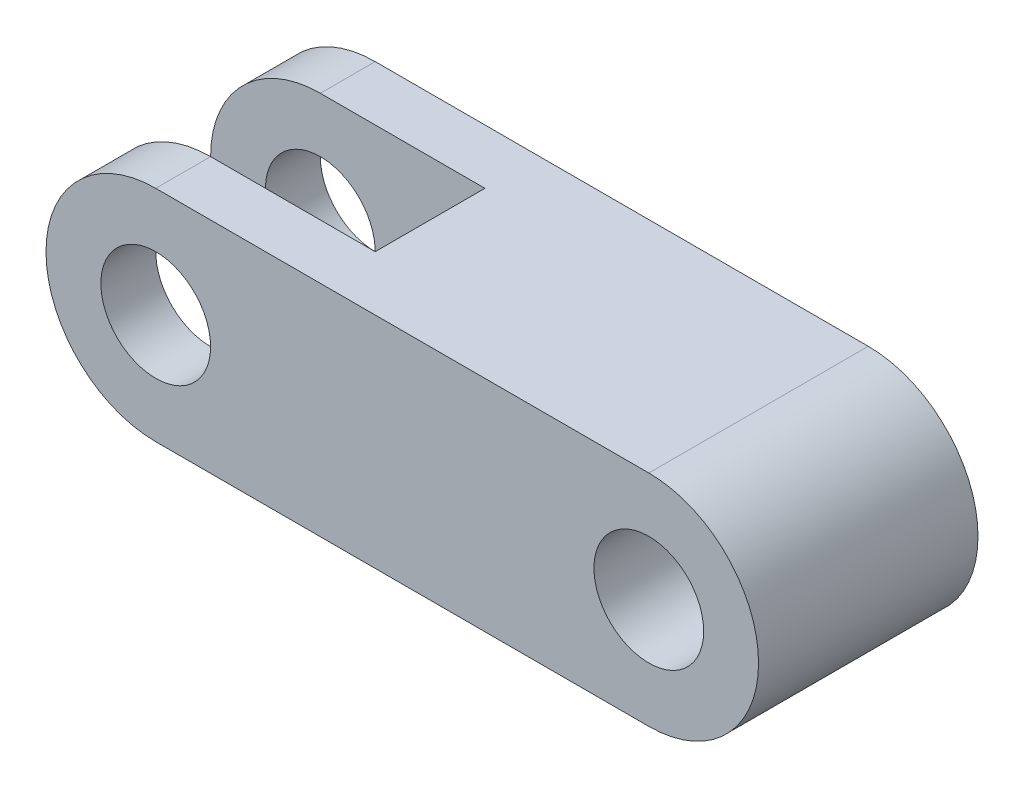
ISO-10303-21;
HEADER;
FILE_DESCRIPTION(('STEP AP214'),'2;1');
FILE_NAME('part.step','',(''),(''),'','','');
FILE_SCHEMA(('AUTOMOTIVE_DESIGN { 1 0 10303 214 1 1 1 1 }'));
ENDSEC;
DATA;
#1=APPLICATION_CONTEXT('core data for automotive mechanical design processes');
#2=APPLICATION_PROTOCOL_DEFINITION('international standard','automotive_design',2000,#1);
#3=PRODUCT_CONTEXT('',#1,'mechanical');
#4=PRODUCT('Part','Part','',(#3));
#5=PRODUCT_RELATED_PRODUCT_CATEGORY('part','',(#4));
#6=PRODUCT_DEFINITION_FORMATION('','',#4);
#7=PRODUCT_DEFINITION_CONTEXT('part definition',#1,'design');
#8=PRODUCT_DEFINITION('design','',#6,#7);
#9=PRODUCT_DEFINITION_SHAPE('','',#8);
#10=(LENGTH_UNIT() NAMED_UNIT(*) SI_UNIT(.MILLI.,.METRE.));
#11=(NAMED_UNIT(*) PLANE_ANGLE_UNIT() SI_UNIT($,.RADIAN.));
#12=(NAMED_UNIT(*) SI_UNIT($,.STERADIAN.) SOLID_ANGLE_UNIT());
#13=UNCERTAINTY_MEASURE_WITH_UNIT(LENGTH_MEASURE(1.E-05),#10,'distance_accuracy_value','');
#14=(GEOMETRIC_REPRESENTATION_CONTEXT(3) GLOBAL_UNCERTAINTY_ASSIGNED_CONTEXT((#13)) GLOBAL_UNIT_ASSIGNED_CONTEXT((#10,
#11,#12)) REPRESENTATION_CONTEXT('',''));
#15=CARTESIAN_POINT('',(0.,0.,0.));
#16=DIRECTION('',(0.,0.,1.));
#17=DIRECTION('',(1.,0.,0.));
#18=AXIS2_PLACEMENT_3D('',#15,#16,#17);
#19=CARTESIAN_POINT('',(0.,0.,20.));
#20=DIRECTION('',(0.,0.,-1.));
#21=DIRECTION('',(-1.,0.,0.));
#22=AXIS2_PLACEMENT_3D('',#19,#20,#21);
#23=CYLINDRICAL_SURFACE('',#22,10.);
#24=DIRECTION('',(0.,0.,-1.));
#25=VECTOR('',#24,1.);
#26=CARTESIAN_POINT('',(0.,10.,20.));
#27=LINE('',#26,#25);
#28=CARTESIAN_POINT('',(0.,10.,20.));
#29=VERTEX_POINT('',#28);
#30=CARTESIAN_POINT('',(0.,10.,15.));
#31=VERTEX_POINT('',#30);
#32=EDGE_CURVE('E167',#29,#31,#27,.T.);
#33=ORIENTED_EDGE('',*,*,#32,.T.);
#34=CARTESIAN_POINT('',(0.,0.,15.));
#35=DIRECTION('',(0.,0.,1.));
#36=DIRECTION('',(1.,0.,0.));
#37=AXIS2_PLACEMENT_3D('',#34,#35,#36);
#38=CIRCLE('',#37,10.);
#39=CARTESIAN_POINT('',(0.,-10.,15.));
#40=VERTEX_POINT('',#39);
#41=EDGE_CURVE('E139',#31,#40,#38,.T.);
#42=ORIENTED_EDGE('',*,*,#41,.T.);
#43=DIRECTION('',(0.,0.,-1.));
#44=VECTOR('',#43,1.);
#45=CARTESIAN_POINT('',(0.,-10.,20.));
#46=LINE('',#45,#44);
#47=CARTESIAN_POINT('',(0.,-10.,20.));
#48=VERTEX_POINT('',#47);
#49=EDGE_CURVE('E11',#48,#40,#46,.T.);
#50=ORIENTED_EDGE('',*,*,#49,.F.);
#51=CARTESIAN_POINT('',(0.,0.,20.));
#52=DIRECTION('',(0.,0.,1.));
#53=DIRECTION('',(1.,0.,0.));
#54=AXIS2_PLACEMENT_3D('',#51,#52,#53);
#55=CIRCLE('',#54,10.);
#56=EDGE_CURVE('E154',#29,#48,#55,.T.);
#57=ORIENTED_EDGE('',*,*,#56,.F.);
#58=EDGE_LOOP('',(#33,#42,#50,#57));
#59=FACE_BOUND('',#58,.T.);
#60=ADVANCED_FACE('F33',(#59),#23,.T.);
#61=CARTESIAN_POINT('',(0.,0.,20.));
#62=DIRECTION('',(0.,0.,-1.));
#63=DIRECTION('',(-1.,0.,0.));
#64=AXIS2_PLACEMENT_3D('',#61,#62,#63);
#65=CYLINDRICAL_SURFACE('',#64,5.);
#66=CARTESIAN_POINT('',(0.,0.,15.));
#67=DIRECTION('',(0.,0.,1.));
#68=DIRECTION('',(1.,0.,0.));
#69=AXIS2_PLACEMENT_3D('',#66,#67,#68);
#70=CIRCLE('',#69,5.);
#71=CARTESIAN_POINT('',(5.,0.,15.));
#72=VERTEX_POINT('',#71);
#73=EDGE_CURVE('E37',#72,#72,#70,.T.);
#74=ORIENTED_EDGE('',*,*,#73,.F.);
#75=EDGE_LOOP('',(#74));
#76=FACE_BOUND('',#75,.T.);
#77=CARTESIAN_POINT('',(0.,0.,20.));
#78=DIRECTION('',(0.,0.,1.));
#79=DIRECTION('',(1.,0.,0.));
#80=AXIS2_PLACEMENT_3D('',#77,#78,#79);
#81=CIRCLE('',#80,5.);
#82=CARTESIAN_POINT('',(5.,0.,20.));
#83=VERTEX_POINT('',#82);
#84=EDGE_CURVE('E148',#83,#83,#81,.T.);
#85=ORIENTED_EDGE('',*,*,#84,.T.);
#86=EDGE_LOOP('',(#85));
#87=FACE_BOUND('',#86,.T.);
#88=ADVANCED_FACE('F185',(#76,#87),#65,.F.);
#89=CARTESIAN_POINT('',(0.,0.,20.));
#90=DIRECTION('',(0.,0.,1.));
#91=DIRECTION('',(1.,0.,0.));
#92=AXIS2_PLACEMENT_3D('',#89,#90,#91);
#93=PLANE('',#92);
#94=ORIENTED_EDGE('',*,*,#84,.F.);
#95=EDGE_LOOP('',(#94));
#96=FACE_BOUND('',#95,.T.);
#97=ORIENTED_EDGE('',*,*,#56,.T.);
#98=DIRECTION('',(1.,0.,0.));
#99=VECTOR('',#98,1.);
#100=CARTESIAN_POINT('',(0.,-10.,20.));
#101=LINE('',#100,#99);
#102=CARTESIAN_POINT('',(44.9357553758638,-10.,20.));
#103=VERTEX_POINT('',#102);
#104=EDGE_CURVE('E88',#48,#103,#101,.T.);
#105=ORIENTED_EDGE('',*,*,#104,.T.);
#106=CARTESIAN_POINT('',(44.9357553758638,0.,20.));
#107=DIRECTION('',(0.,0.,1.));
#108=DIRECTION('',(1.,0.,0.));
#109=AXIS2_PLACEMENT_3D('',#106,#107,#108);
#110=CIRCLE('',#109,10.);
#111=CARTESIAN_POINT('',(44.9357553758638,10.,20.));
#112=VERTEX_POINT('',#111);
#113=EDGE_CURVE('E158',#103,#112,#110,.T.);
#114=ORIENTED_EDGE('',*,*,#113,.T.);
#115=DIRECTION('',(-1.,0.,0.));
#116=VECTOR('',#115,1.);
#117=CARTESIAN_POINT('',(0.,10.,20.));
#118=LINE('',#117,#116);
#119=EDGE_CURVE('E59',#112,#29,#118,.T.);
#120=ORIENTED_EDGE('',*,*,#119,.T.);
#121=EDGE_LOOP('',(#97,#105,#114,#120));
#122=FACE_BOUND('',#121,.T.);
#123=CARTESIAN_POINT('',(44.9357553758638,0.,20.));
#124=DIRECTION('',(0.,0.,1.));
#125=DIRECTION('',(1.,0.,0.));
#126=AXIS2_PLACEMENT_3D('',#123,#124,#125);
#127=CIRCLE('',#126,5.);
#128=CARTESIAN_POINT('',(49.9357553758638,0.,20.));
#129=VERTEX_POINT('',#128);
#130=EDGE_CURVE('E142',#129,#129,#127,.T.);
#131=ORIENTED_EDGE('',*,*,#130,.F.);
#132=EDGE_LOOP('',(#131));
#133=FACE_BOUND('',#132,.T.);
#134=ADVANCED_FACE('F191',(#96,#122,#133),#93,.T.);
#135=CARTESIAN_POINT('',(0.,0.,0.));
#136=DIRECTION('',(0.,0.,1.));
#137=DIRECTION('',(1.,0.,0.));
#138=AXIS2_PLACEMENT_3D('',#135,#136,#137);
#139=PLANE('',#138);
#140=CARTESIAN_POINT('',(0.,0.,0.));
#141=DIRECTION('',(0.,0.,1.));
#142=DIRECTION('',(1.,0.,0.));
#143=AXIS2_PLACEMENT_3D('',#140,#141,#142);
#144=CIRCLE('',#143,10.);
#145=CARTESIAN_POINT('',(0.,10.,0.));
#146=VERTEX_POINT('',#145);
#147=CARTESIAN_POINT('',(0.,-10.,0.));
#148=VERTEX_POINT('',#147);
#149=EDGE_CURVE('E151',#146,#148,#144,.T.);
#150=ORIENTED_EDGE('',*,*,#149,.F.);
#151=DIRECTION('',(-1.,0.,0.));
#152=VECTOR('',#151,1.);
#153=CARTESIAN_POINT('',(0.,10.,0.));
#154=LINE('',#153,#152);
#155=CARTESIAN_POINT('',(44.9357553758638,10.,0.));
#156=VERTEX_POINT('',#155);
#157=EDGE_CURVE('E156',#156,#146,#154,.T.);
#158=ORIENTED_EDGE('',*,*,#157,.F.);
#159=CARTESIAN_POINT('',(44.9357553758638,0.,0.));
#160=DIRECTION('',(0.,0.,1.));
#161=DIRECTION('',(1.,0.,0.));
#162=AXIS2_PLACEMENT_3D('',#159,#160,#161);
#163=CIRCLE('',#162,10.);
#164=CARTESIAN_POINT('',(44.9357553758638,-10.,0.));
#165=VERTEX_POINT('',#164);
#166=EDGE_CURVE('E164',#165,#156,#163,.T.);
#167=ORIENTED_EDGE('',*,*,#166,.F.);
#168=DIRECTION('',(1.,0.,0.));
#169=VECTOR('',#168,1.);
#170=CARTESIAN_POINT('',(0.,-10.,0.));
#171=LINE('',#170,#169);
#172=EDGE_CURVE('E162',#148,#165,#171,.T.);
#173=ORIENTED_EDGE('',*,*,#172,.F.);
#174=EDGE_LOOP('',(#150,#158,#167,#173));
#175=FACE_BOUND('',#174,.T.);
#176=CARTESIAN_POINT('',(0.,0.,0.));
#177=DIRECTION('',(0.,0.,1.));
#178=DIRECTION('',(1.,0.,0.));
#179=AXIS2_PLACEMENT_3D('',#176,#177,#178);
#180=CIRCLE('',#179,5.);
#181=CARTESIAN_POINT('',(5.,0.,0.));
#182=VERTEX_POINT('',#181);
#183=EDGE_CURVE('E145',#182,#182,#180,.T.);
#184=ORIENTED_EDGE('',*,*,#183,.T.);
#185=EDGE_LOOP('',(#184));
#186=FACE_BOUND('',#185,.T.);
#187=CARTESIAN_POINT('',(44.9357553758638,0.,0.));
#188=DIRECTION('',(0.,0.,1.));
#189=DIRECTION('',(1.,0.,0.));
#190=AXIS2_PLACEMENT_3D('',#187,#188,#189);
#191=CIRCLE('',#190,5.);
#192=CARTESIAN_POINT('',(49.9357553758638,0.,0.));
#193=VERTEX_POINT('',#192);
#194=EDGE_CURVE('E141',#193,#193,#191,.T.);
#195=ORIENTED_EDGE('',*,*,#194,.T.);
#196=EDGE_LOOP('',(#195));
#197=FACE_BOUND('',#196,.T.);
#198=ADVANCED_FACE('F188',(#175,#186,#197),#139,.F.);
#199=CARTESIAN_POINT('',(0.,0.,5.));
#200=DIRECTION('',(0.,0.,-1.));
#201=DIRECTION('',(-1.,0.,0.));
#202=AXIS2_PLACEMENT_3D('',#199,#200,#201);
#203=CIRCLE('',#202,10.);
#204=CARTESIAN_POINT('',(0.,-10.,5.));
#205=VERTEX_POINT('',#204);
#206=CARTESIAN_POINT('',(0.,10.,5.));
#207=VERTEX_POINT('',#206);
#208=EDGE_CURVE('E123',#205,#207,#203,.T.);
#209=ORIENTED_EDGE('',*,*,#208,.T.);
#210=EDGE_CURVE('E81',#207,#146,#27,.T.);
#211=ORIENTED_EDGE('',*,*,#210,.T.);
#212=ORIENTED_EDGE('',*,*,#149,.T.);
#213=EDGE_CURVE('E42',#205,#148,#46,.T.);
#214=ORIENTED_EDGE('',*,*,#213,.F.);
#215=EDGE_LOOP('',(#209,#211,#212,#214));
#216=FACE_BOUND('',#215,.T.);
#217=ADVANCED_FACE('F35',(#216),#23,.T.);
#218=CARTESIAN_POINT('',(0.,-10.,20.));
#219=DIRECTION('',(0.,1.,0.));
#220=DIRECTION('',(0.,0.,1.));
#221=AXIS2_PLACEMENT_3D('',#218,#219,#220);
#222=PLANE('',#221);
#223=ORIENTED_EDGE('',*,*,#49,.T.);
#224=DIRECTION('',(1.,0.,0.));
#225=VECTOR('',#224,1.);
#226=CARTESIAN_POINT('',(15.,-10.,15.));
#227=LINE('',#226,#225);
#228=CARTESIAN_POINT('',(15.,-10.,15.));
#229=VERTEX_POINT('',#228);
#230=EDGE_CURVE('E118',#40,#229,#227,.T.);
#231=ORIENTED_EDGE('',*,*,#230,.T.);
#232=DIRECTION('',(0.,0.,-1.));
#233=VECTOR('',#232,1.);
#234=CARTESIAN_POINT('',(15.,-10.,5.));
#235=LINE('',#234,#233);
#236=CARTESIAN_POINT('',(15.,-10.,5.));
#237=VERTEX_POINT('',#236);
#238=EDGE_CURVE('E112',#229,#237,#235,.T.);
#239=ORIENTED_EDGE('',*,*,#238,.T.);
#240=DIRECTION('',(-1.,0.,0.));
#241=VECTOR('',#240,1.);
#242=CARTESIAN_POINT('',(15.,-10.,5.));
#243=LINE('',#242,#241);
#244=EDGE_CURVE('E121',#237,#205,#243,.T.);
#245=ORIENTED_EDGE('',*,*,#244,.T.);
#246=ORIENTED_EDGE('',*,*,#213,.T.);
#247=ORIENTED_EDGE('',*,*,#172,.T.);
#248=DIRECTION('',(0.,0.,-1.));
#249=VECTOR('',#248,1.);
#250=CARTESIAN_POINT('',(44.9357553758638,-10.,20.));
#251=LINE('',#250,#249);
#252=EDGE_CURVE('E173',#103,#165,#251,.T.);
#253=ORIENTED_EDGE('',*,*,#252,.F.);
#254=ORIENTED_EDGE('',*,*,#104,.F.);
#255=EDGE_LOOP('',(#223,#231,#239,#245,#246,#247,#253,#254));
#256=FACE_BOUND('',#255,.T.);
#257=ADVANCED_FACE('F126',(#256),#222,.F.);
#258=CARTESIAN_POINT('',(44.9357553758638,0.,20.));
#259=DIRECTION('',(0.,0.,-1.));
#260=DIRECTION('',(-1.,0.,0.));
#261=AXIS2_PLACEMENT_3D('',#258,#259,#260);
#262=CYLINDRICAL_SURFACE('',#261,10.);
#263=ORIENTED_EDGE('',*,*,#166,.T.);
#264=DIRECTION('',(0.,0.,-1.));
#265=VECTOR('',#264,1.);
#266=CARTESIAN_POINT('',(44.9357553758638,10.,20.));
#267=LINE('',#266,#265);
#268=EDGE_CURVE('E170',#112,#156,#267,.T.);
#269=ORIENTED_EDGE('',*,*,#268,.F.);
#270=ORIENTED_EDGE('',*,*,#113,.F.);
#271=ORIENTED_EDGE('',*,*,#252,.T.);
#272=EDGE_LOOP('',(#263,#269,#270,#271));
#273=FACE_BOUND('',#272,.T.);
#274=ADVANCED_FACE('F216',(#273),#262,.T.);
#275=CARTESIAN_POINT('',(0.,10.,20.));
#276=DIRECTION('',(0.,-1.,0.));
#277=DIRECTION('',(0.,0.,-1.));
#278=AXIS2_PLACEMENT_3D('',#275,#276,#277);
#279=PLANE('',#278);
#280=DIRECTION('',(0.,0.,-1.));
#281=VECTOR('',#280,1.);
#282=CARTESIAN_POINT('',(15.,10.,5.));
#283=LINE('',#282,#281);
#284=CARTESIAN_POINT('',(15.,10.,15.));
#285=VERTEX_POINT('',#284);
#286=CARTESIAN_POINT('',(15.,10.,5.));
#287=VERTEX_POINT('',#286);
#288=EDGE_CURVE('E50',#285,#287,#283,.T.);
#289=ORIENTED_EDGE('',*,*,#288,.F.);
#290=DIRECTION('',(1.,0.,0.));
#291=VECTOR('',#290,1.);
#292=CARTESIAN_POINT('',(15.,10.,15.));
#293=LINE('',#292,#291);
#294=EDGE_CURVE('E128',#31,#285,#293,.T.);
#295=ORIENTED_EDGE('',*,*,#294,.F.);
#296=ORIENTED_EDGE('',*,*,#32,.F.);
#297=ORIENTED_EDGE('',*,*,#119,.F.);
#298=ORIENTED_EDGE('',*,*,#268,.T.);
#299=ORIENTED_EDGE('',*,*,#157,.T.);
#300=ORIENTED_EDGE('',*,*,#210,.F.);
#301=DIRECTION('',(-1.,0.,0.));
#302=VECTOR('',#301,1.);
#303=CARTESIAN_POINT('',(15.,10.,5.));
#304=LINE('',#303,#302);
#305=EDGE_CURVE('E130',#287,#207,#304,.T.);
#306=ORIENTED_EDGE('',*,*,#305,.F.);
#307=EDGE_LOOP('',(#289,#295,#296,#297,#298,#299,#300,#306));
#308=FACE_BOUND('',#307,.T.);
#309=ADVANCED_FACE('F183',(#308),#279,.F.);
#310=CARTESIAN_POINT('',(0.,0.,5.));
#311=DIRECTION('',(0.,0.,-1.));
#312=DIRECTION('',(-1.,0.,0.));
#313=AXIS2_PLACEMENT_3D('',#310,#311,#312);
#314=CIRCLE('',#313,5.);
#315=CARTESIAN_POINT('',(-5.,0.,5.));
#316=VERTEX_POINT('',#315);
#317=EDGE_CURVE('E136',#316,#316,#314,.T.);
#318=ORIENTED_EDGE('',*,*,#317,.F.);
#319=EDGE_LOOP('',(#318));
#320=FACE_BOUND('',#319,.T.);
#321=ORIENTED_EDGE('',*,*,#183,.F.);
#322=EDGE_LOOP('',(#321));
#323=FACE_BOUND('',#322,.T.);
#324=ADVANCED_FACE('F179',(#320,#323),#65,.F.);
#325=CARTESIAN_POINT('',(44.9357553758638,0.,20.));
#326=DIRECTION('',(0.,0.,-1.));
#327=DIRECTION('',(-1.,0.,0.));
#328=AXIS2_PLACEMENT_3D('',#325,#326,#327);
#329=CYLINDRICAL_SURFACE('',#328,5.);
#330=ORIENTED_EDGE('',*,*,#130,.T.);
#331=EDGE_LOOP('',(#330));
#332=FACE_BOUND('',#331,.T.);
#333=ORIENTED_EDGE('',*,*,#194,.F.);
#334=EDGE_LOOP('',(#333));
#335=FACE_BOUND('',#334,.T.);
#336=ADVANCED_FACE('F182',(#332,#335),#329,.F.);
#337=CARTESIAN_POINT('',(15.,-10.,15.));
#338=DIRECTION('',(0.,0.,1.));
#339=DIRECTION('',(1.,0.,0.));
#340=AXIS2_PLACEMENT_3D('',#337,#338,#339);
#341=PLANE('',#340);
#342=ORIENTED_EDGE('',*,*,#73,.T.);
#343=EDGE_LOOP('',(#342));
#344=FACE_BOUND('',#343,.T.);
#345=ORIENTED_EDGE('',*,*,#294,.T.);
#346=DIRECTION('',(0.,1.,0.));
#347=VECTOR('',#346,1.);
#348=CARTESIAN_POINT('',(15.,-10.,15.));
#349=LINE('',#348,#347);
#350=EDGE_CURVE('E117',#229,#285,#349,.T.);
#351=ORIENTED_EDGE('',*,*,#350,.F.);
#352=ORIENTED_EDGE('',*,*,#230,.F.);
#353=ORIENTED_EDGE('',*,*,#41,.F.);
#354=EDGE_LOOP('',(#345,#351,#352,#353));
#355=FACE_BOUND('',#354,.T.);
#356=ADVANCED_FACE('F197',(#344,#355),#341,.F.);
#357=CARTESIAN_POINT('',(15.,-10.,5.));
#358=DIRECTION('',(0.,0.,-1.));
#359=DIRECTION('',(-1.,0.,0.));
#360=AXIS2_PLACEMENT_3D('',#357,#358,#359);
#361=PLANE('',#360);
#362=ORIENTED_EDGE('',*,*,#317,.T.);
#363=EDGE_LOOP('',(#362));
#364=FACE_BOUND('',#363,.T.);
#365=ORIENTED_EDGE('',*,*,#208,.F.);
#366=ORIENTED_EDGE('',*,*,#244,.F.);
#367=DIRECTION('',(0.,1.,0.));
#368=VECTOR('',#367,1.);
#369=CARTESIAN_POINT('',(15.,-10.,5.));
#370=LINE('',#369,#368);
#371=EDGE_CURVE('E108',#237,#287,#370,.T.);
#372=ORIENTED_EDGE('',*,*,#371,.T.);
#373=ORIENTED_EDGE('',*,*,#305,.T.);
#374=EDGE_LOOP('',(#365,#366,#372,#373));
#375=FACE_BOUND('',#374,.T.);
#376=ADVANCED_FACE('F122',(#364,#375),#361,.F.);
#377=CARTESIAN_POINT('',(15.,-10.,5.));
#378=DIRECTION('',(1.,0.,0.));
#379=DIRECTION('',(0.,0.,-1.));
#380=AXIS2_PLACEMENT_3D('',#377,#378,#379);
#381=PLANE('',#380);
#382=ORIENTED_EDGE('',*,*,#288,.T.);
#383=ORIENTED_EDGE('',*,*,#371,.F.);
#384=ORIENTED_EDGE('',*,*,#238,.F.);
#385=ORIENTED_EDGE('',*,*,#350,.T.);
#386=EDGE_LOOP('',(#382,#383,#384,#385));
#387=FACE_BOUND('',#386,.T.);
#388=ADVANCED_FACE('F110',(#387),#381,.F.);
#389=CLOSED_SHELL('',(#60,#88,#134,#198,#217,#257,#274,#309,#324,#336,#356,#376,#388));
#390=MANIFOLD_SOLID_BREP('B2',#389);
#391=ADVANCED_BREP_SHAPE_REPRESENTATION('',(#18,#390),#14);
#392=SHAPE_DEFINITION_REPRESENTATION(#9,#391);
ENDSEC;
END-ISO-10303-21;
